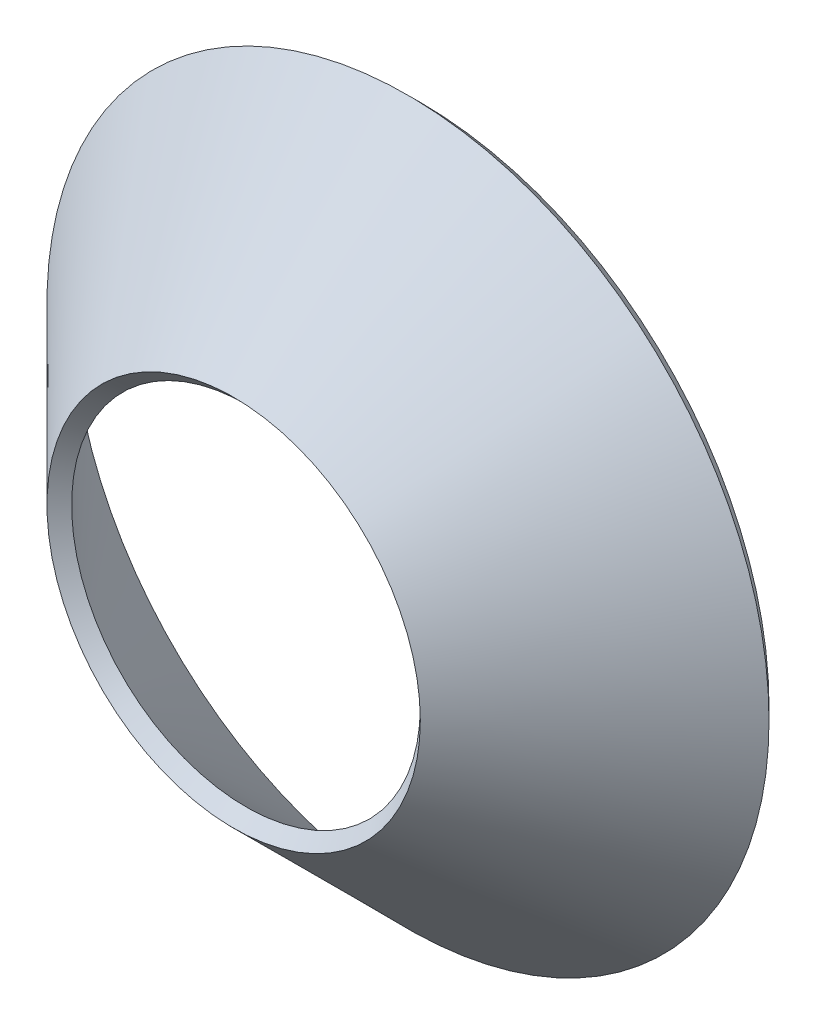
ISO-10303-21;
HEADER;
FILE_DESCRIPTION(('STEP AP214'),'2;1');
FILE_NAME('part.step','',(''),(''),'','','');
FILE_SCHEMA(('AUTOMOTIVE_DESIGN { 1 0 10303 214 1 1 1 1 }'));
ENDSEC;
DATA;
#1=APPLICATION_CONTEXT('core data for automotive mechanical design processes');
#2=APPLICATION_PROTOCOL_DEFINITION('international standard','automotive_design',2000,#1);
#3=PRODUCT_CONTEXT('',#1,'mechanical');
#4=PRODUCT('Part','Part','',(#3));
#5=PRODUCT_RELATED_PRODUCT_CATEGORY('part','',(#4));
#6=PRODUCT_DEFINITION_FORMATION('','',#4);
#7=PRODUCT_DEFINITION_CONTEXT('part definition',#1,'design');
#8=PRODUCT_DEFINITION('design','',#6,#7);
#9=PRODUCT_DEFINITION_SHAPE('','',#8);
#10=(LENGTH_UNIT() NAMED_UNIT(*) SI_UNIT(.MILLI.,.METRE.));
#11=(NAMED_UNIT(*) PLANE_ANGLE_UNIT() SI_UNIT($,.RADIAN.));
#12=(NAMED_UNIT(*) SI_UNIT($,.STERADIAN.) SOLID_ANGLE_UNIT());
#13=UNCERTAINTY_MEASURE_WITH_UNIT(LENGTH_MEASURE(1.E-05),#10,'distance_accuracy_value','');
#14=(GEOMETRIC_REPRESENTATION_CONTEXT(3) GLOBAL_UNCERTAINTY_ASSIGNED_CONTEXT((#13)) GLOBAL_UNIT_ASSIGNED_CONTEXT((#10,
#11,#12)) REPRESENTATION_CONTEXT('',''));
#15=CARTESIAN_POINT('',(0.,0.,0.));
#16=DIRECTION('',(0.,0.,1.));
#17=DIRECTION('',(1.,0.,0.));
#18=AXIS2_PLACEMENT_3D('',#15,#16,#17);
#19=CARTESIAN_POINT('',(0.,0.,25.4));
#20=DIRECTION('',(0.,0.,-1.));
#21=DIRECTION('',(-1.,0.,0.));
#22=AXIS2_PLACEMENT_3D('',#19,#20,#21);
#23=CONICAL_SURFACE('',#22,25.4,0.785398163397454);
#24=CARTESIAN_POINT('',(0.,0.,0.));
#25=DIRECTION('',(0.,0.,1.));
#26=DIRECTION('',(1.,0.,0.));
#27=AXIS2_PLACEMENT_3D('',#24,#25,#26);
#28=CIRCLE('',#27,50.8000000000003);
#29=CARTESIAN_POINT('',(50.8000000000003,0.,0.));
#30=VERTEX_POINT('',#29);
#31=EDGE_CURVE('E60',#30,#30,#28,.T.);
#32=ORIENTED_EDGE('',*,*,#31,.F.);
#33=EDGE_LOOP('',(#32));
#34=FACE_BOUND('',#33,.T.);
#35=CARTESIAN_POINT('',(0.,0.,25.4));
#36=DIRECTION('',(0.,0.,1.));
#37=DIRECTION('',(1.,0.,0.));
#38=AXIS2_PLACEMENT_3D('',#35,#36,#37);
#39=CIRCLE('',#38,25.4);
#40=CARTESIAN_POINT('',(25.4,0.,25.4));
#41=VERTEX_POINT('',#40);
#42=EDGE_CURVE('E10',#41,#41,#39,.T.);
#43=ORIENTED_EDGE('',*,*,#42,.T.);
#44=EDGE_LOOP('',(#43));
#45=FACE_BOUND('',#44,.T.);
#46=ADVANCED_FACE('F43',(#34,#45),#23,.F.);
#47=CARTESIAN_POINT('',(0.,0.,25.4));
#48=DIRECTION('',(0.,0.,1.));
#49=DIRECTION('',(1.,0.,0.));
#50=AXIS2_PLACEMENT_3D('',#47,#48,#49);
#51=CONICAL_SURFACE('',#50,25.4,0.785398163397443);
#52=CARTESIAN_POINT('',(0.,0.,27.1960512242138));
#53=DIRECTION('',(0.,0.,1.));
#54=DIRECTION('',(1.,0.,0.));
#55=AXIS2_PLACEMENT_3D('',#52,#53,#54);
#56=CIRCLE('',#55,27.1960512242138);
#57=CARTESIAN_POINT('',(27.1960512242138,0.,27.1960512242138));
#58=VERTEX_POINT('',#57);
#59=EDGE_CURVE('E50',#58,#58,#56,.T.);
#60=ORIENTED_EDGE('',*,*,#59,.T.);
#61=EDGE_LOOP('',(#60));
#62=FACE_BOUND('',#61,.T.);
#63=ORIENTED_EDGE('',*,*,#42,.F.);
#64=EDGE_LOOP('',(#63));
#65=FACE_BOUND('',#64,.T.);
#66=ADVANCED_FACE('F71',(#62,#65),#51,.F.);
#67=CARTESIAN_POINT('',(0.,0.,27.1960512242138));
#68=DIRECTION('',(0.,0.,-1.));
#69=DIRECTION('',(-1.,0.,0.));
#70=AXIS2_PLACEMENT_3D('',#67,#68,#69);
#71=CONICAL_SURFACE('',#70,27.1960512242138,0.785398163397454);
#72=CARTESIAN_POINT('',(0.,0.,1.79605122421384));
#73=DIRECTION('',(0.,0.,1.));
#74=DIRECTION('',(1.,0.,0.));
#75=AXIS2_PLACEMENT_3D('',#72,#73,#74);
#76=CIRCLE('',#75,52.5960512242141);
#77=CARTESIAN_POINT('',(52.5960512242141,0.,1.79605122421384));
#78=VERTEX_POINT('',#77);
#79=EDGE_CURVE('E55',#78,#78,#76,.T.);
#80=ORIENTED_EDGE('',*,*,#79,.T.);
#81=EDGE_LOOP('',(#80));
#82=FACE_BOUND('',#81,.T.);
#83=ORIENTED_EDGE('',*,*,#59,.F.);
#84=EDGE_LOOP('',(#83));
#85=FACE_BOUND('',#84,.T.);
#86=ADVANCED_FACE('F75',(#82,#85),#71,.T.);
#87=CARTESIAN_POINT('',(0.,0.,1.79605122421384));
#88=DIRECTION('',(0.,0.,1.));
#89=DIRECTION('',(1.,0.,0.));
#90=AXIS2_PLACEMENT_3D('',#87,#88,#89);
#91=CONICAL_SURFACE('',#90,52.5960512242141,0.785398163397445);
#92=ORIENTED_EDGE('',*,*,#31,.T.);
#93=EDGE_LOOP('',(#92));
#94=FACE_BOUND('',#93,.T.);
#95=ORIENTED_EDGE('',*,*,#79,.F.);
#96=EDGE_LOOP('',(#95));
#97=FACE_BOUND('',#96,.T.);
#98=ADVANCED_FACE('F67',(#94,#97),#91,.T.);
#99=CLOSED_SHELL('',(#46,#66,#86,#98));
#100=MANIFOLD_SOLID_BREP('B2',#99);
#101=ADVANCED_BREP_SHAPE_REPRESENTATION('',(#18,#100),#14);
#102=SHAPE_DEFINITION_REPRESENTATION(#9,#101);
ENDSEC;
END-ISO-10303-21;
